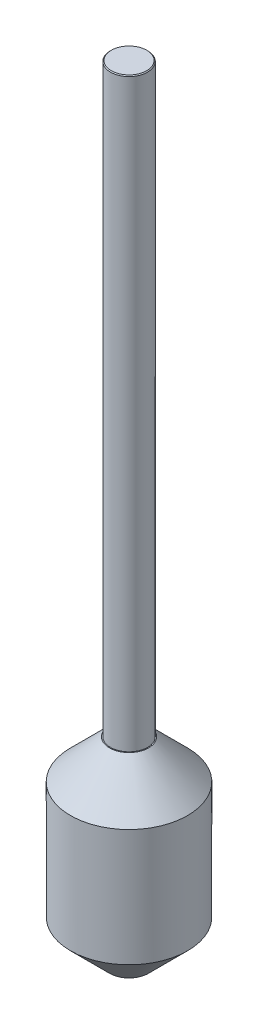
ISO-10303-21;
HEADER;
FILE_DESCRIPTION(('STEP AP214'),'2;1');
FILE_NAME('part.step','',(''),(''),'','','');
FILE_SCHEMA(('AUTOMOTIVE_DESIGN { 1 0 10303 214 1 1 1 1 }'));
ENDSEC;
DATA;
#1=APPLICATION_CONTEXT('core data for automotive mechanical design processes');
#2=APPLICATION_PROTOCOL_DEFINITION('international standard','automotive_design',2000,#1);
#3=PRODUCT_CONTEXT('',#1,'mechanical');
#4=PRODUCT('Part','Part','',(#3));
#5=PRODUCT_RELATED_PRODUCT_CATEGORY('part','',(#4));
#6=PRODUCT_DEFINITION_FORMATION('','',#4);
#7=PRODUCT_DEFINITION_CONTEXT('part definition',#1,'design');
#8=PRODUCT_DEFINITION('design','',#6,#7);
#9=PRODUCT_DEFINITION_SHAPE('','',#8);
#10=(LENGTH_UNIT() NAMED_UNIT(*) SI_UNIT(.MILLI.,.METRE.));
#11=(NAMED_UNIT(*) PLANE_ANGLE_UNIT() SI_UNIT($,.RADIAN.));
#12=(NAMED_UNIT(*) SI_UNIT($,.STERADIAN.) SOLID_ANGLE_UNIT());
#13=UNCERTAINTY_MEASURE_WITH_UNIT(LENGTH_MEASURE(1.E-05),#10,'distance_accuracy_value','');
#14=(GEOMETRIC_REPRESENTATION_CONTEXT(3) GLOBAL_UNCERTAINTY_ASSIGNED_CONTEXT((#13)) GLOBAL_UNIT_ASSIGNED_CONTEXT((#10,
#11,#12)) REPRESENTATION_CONTEXT('',''));
#15=CARTESIAN_POINT('',(0.,0.,0.));
#16=DIRECTION('',(0.,0.,1.));
#17=DIRECTION('',(1.,0.,0.));
#18=AXIS2_PLACEMENT_3D('',#15,#16,#17);
#19=CARTESIAN_POINT('',(5.,0.,0.));
#20=DIRECTION('',(0.,-1.,0.));
#21=DIRECTION('',(0.,0.,-1.));
#22=AXIS2_PLACEMENT_3D('',#19,#20,#21);
#23=CONICAL_SURFACE('',#22,5.,0.785398163397448);
#24=CARTESIAN_POINT('',(5.,-10.,0.));
#25=DIRECTION('',(0.,-1.,0.));
#26=DIRECTION('',(0.,0.,-1.));
#27=AXIS2_PLACEMENT_3D('',#24,#25,#26);
#28=CIRCLE('',#27,15.);
#29=CARTESIAN_POINT('',(5.,-10.,-15.));
#30=VERTEX_POINT('',#29);
#31=EDGE_CURVE('E10',#30,#30,#28,.T.);
#32=CARTESIAN_POINT('',(5.,0.,0.));
#33=DIRECTION('',(0.,-1.,0.));
#34=DIRECTION('',(0.,0.,-1.));
#35=AXIS2_PLACEMENT_3D('',#32,#33,#34);
#36=CIRCLE('',#35,5.);
#37=CARTESIAN_POINT('',(5.,0.,-5.));
#38=VERTEX_POINT('',#37);
#39=EDGE_CURVE('E63',#38,#38,#36,.T.);
#40=CARTESIAN_POINT('',(5.,-10.,-15.));
#41=CARTESIAN_POINT('',(5.,-9.89583333333333,-14.8958333333333));
#42=CARTESIAN_POINT('',(5.,-9.79166666666667,-14.7916666666667));
#43=CARTESIAN_POINT('',(5.,-9.58333333333333,-14.5833333333333));
#44=CARTESIAN_POINT('',(5.,-9.47916666666667,-14.4791666666667));
#45=CARTESIAN_POINT('',(5.,-9.27083333333333,-14.2708333333333));
#46=CARTESIAN_POINT('',(5.,-9.16666666666666,-14.1666666666667));
#47=CARTESIAN_POINT('',(5.,-8.95833333333333,-13.9583333333333));
#48=CARTESIAN_POINT('',(5.,-8.85416666666667,-13.8541666666667));
#49=CARTESIAN_POINT('',(5.,-8.64583333333333,-13.6458333333333));
#50=CARTESIAN_POINT('',(5.,-8.54166666666667,-13.5416666666667));
#51=CARTESIAN_POINT('',(5.,-8.33333333333333,-13.3333333333333));
#52=CARTESIAN_POINT('',(5.,-8.22916666666667,-13.2291666666667));
#53=CARTESIAN_POINT('',(5.,-8.02083333333333,-13.0208333333333));
#54=CARTESIAN_POINT('',(5.,-7.91666666666667,-12.9166666666667));
#55=CARTESIAN_POINT('',(5.,-7.70833333333333,-12.7083333333333));
#56=CARTESIAN_POINT('',(5.,-7.60416666666667,-12.6041666666667));
#57=CARTESIAN_POINT('',(5.,-7.39583333333333,-12.3958333333333));
#58=CARTESIAN_POINT('',(5.,-7.29166666666667,-12.2916666666667));
#59=CARTESIAN_POINT('',(5.,-7.08333333333333,-12.0833333333333));
#60=CARTESIAN_POINT('',(5.,-6.97916666666667,-11.9791666666667));
#61=CARTESIAN_POINT('',(5.,-6.77083333333333,-11.7708333333333));
#62=CARTESIAN_POINT('',(5.,-6.66666666666667,-11.6666666666667));
#63=CARTESIAN_POINT('',(5.,-6.45833333333333,-11.4583333333333));
#64=CARTESIAN_POINT('',(5.,-6.35416666666667,-11.3541666666667));
#65=CARTESIAN_POINT('',(5.,-6.14583333333333,-11.1458333333333));
#66=CARTESIAN_POINT('',(5.,-6.04166666666667,-11.0416666666667));
#67=CARTESIAN_POINT('',(5.,-5.83333333333333,-10.8333333333333));
#68=CARTESIAN_POINT('',(5.,-5.72916666666667,-10.7291666666667));
#69=CARTESIAN_POINT('',(5.,-5.52083333333333,-10.5208333333333));
#70=CARTESIAN_POINT('',(5.,-5.41666666666667,-10.4166666666667));
#71=CARTESIAN_POINT('',(5.,-5.20833333333333,-10.2083333333333));
#72=CARTESIAN_POINT('',(5.,-5.10416666666667,-10.1041666666667));
#73=CARTESIAN_POINT('',(5.,-4.89583333333333,-9.89583333333333));
#74=CARTESIAN_POINT('',(5.,-4.79166666666667,-9.79166666666667));
#75=CARTESIAN_POINT('',(5.,-4.58333333333333,-9.58333333333333));
#76=CARTESIAN_POINT('',(5.,-4.47916666666667,-9.47916666666667));
#77=CARTESIAN_POINT('',(5.,-4.27083333333333,-9.27083333333333));
#78=CARTESIAN_POINT('',(5.,-4.16666666666667,-9.16666666666666));
#79=CARTESIAN_POINT('',(5.,-3.95833333333333,-8.95833333333333));
#80=CARTESIAN_POINT('',(5.,-3.85416666666667,-8.85416666666666));
#81=CARTESIAN_POINT('',(5.,-3.64583333333333,-8.64583333333333));
#82=CARTESIAN_POINT('',(5.,-3.54166666666667,-8.54166666666667));
#83=CARTESIAN_POINT('',(5.,-3.33333333333333,-8.33333333333333));
#84=CARTESIAN_POINT('',(5.,-3.22916666666667,-8.22916666666667));
#85=CARTESIAN_POINT('',(5.,-3.02083333333333,-8.02083333333333));
#86=CARTESIAN_POINT('',(5.,-2.91666666666667,-7.91666666666667));
#87=CARTESIAN_POINT('',(5.,-2.70833333333333,-7.70833333333333));
#88=CARTESIAN_POINT('',(5.,-2.60416666666667,-7.60416666666667));
#89=CARTESIAN_POINT('',(5.,-2.39583333333333,-7.39583333333333));
#90=CARTESIAN_POINT('',(5.,-2.29166666666667,-7.29166666666667));
#91=CARTESIAN_POINT('',(5.,-2.08333333333333,-7.08333333333333));
#92=CARTESIAN_POINT('',(5.,-1.97916666666667,-6.97916666666667));
#93=CARTESIAN_POINT('',(5.,-1.77083333333333,-6.77083333333333));
#94=CARTESIAN_POINT('',(5.,-1.66666666666667,-6.66666666666667));
#95=CARTESIAN_POINT('',(5.,-1.45833333333333,-6.45833333333333));
#96=CARTESIAN_POINT('',(5.,-1.35416666666667,-6.35416666666667));
#97=CARTESIAN_POINT('',(5.,-1.14583333333333,-6.14583333333333));
#98=CARTESIAN_POINT('',(5.,-1.04166666666667,-6.04166666666667));
#99=CARTESIAN_POINT('',(5.,-0.833333333333333,-5.83333333333333));
#100=CARTESIAN_POINT('',(5.,-0.729166666666667,-5.72916666666667));
#101=CARTESIAN_POINT('',(5.,-0.520833333333334,-5.52083333333333));
#102=CARTESIAN_POINT('',(5.,-0.416666666666667,-5.41666666666667));
#103=CARTESIAN_POINT('',(5.,-0.208333333333334,-5.20833333333333));
#104=CARTESIAN_POINT('',(5.,-0.104166666666667,-5.10416666666667));
#105=CARTESIAN_POINT('',(5.,0.,-5.));
#106=B_SPLINE_CURVE_WITH_KNOTS('',3,(#40,#41,#42,#43,#44,#45,#46,#47,#48,#49,#50,#51,#52,#53,
#54,#55,#56,#57,#58,#59,#60,#61,#62,#63,#64,#65,#66,#67,#68,#69,#70,#71,#72,#73,#74,#75,#76,#77,
#78,#79,#80,#81,#82,#83,#84,#85,#86,#87,#88,#89,#90,#91,#92,#93,#94,#95,#96,#97,#98,#99,#100,
#101,#102,#103,#104,#105),.UNSPECIFIED.,.F.,.F.,(4,2,2,2,2,2,2,2,2,2,2,2,2,2,2,2,2,2,2,2,2,2,2,
2,2,2,2,2,2,2,2,2,4),(0.,0.441941738241593,0.883883476483185,1.32582521472478,1.76776695296637,
2.20970869120796,2.65165042944955,3.09359216769115,3.53553390593274,3.97747564417433,
4.41941738241592,4.86135912065751,5.30330085889911,5.7452425971407,6.18718433538229,
6.62912607362388,7.07106781186547,7.51300955010706,7.95495128834866,8.39689302659025,
8.83883476483184,9.28077650307343,9.72271824131502,10.1646599795566,10.6066017177982,
11.0485434560398,11.4904851942814,11.932426932523,12.3743686707646,12.8163104090062,
13.2582521472478,13.7001938854893,14.1421356237309),.UNSPECIFIED.);
#107=EDGE_CURVE('BSEAM40',#30,#38,#106,.T.);
#108=ORIENTED_EDGE('',*,*,#31,.F.);
#109=ORIENTED_EDGE('',*,*,#39,.T.);
#110=ORIENTED_EDGE('',*,*,#107,.T.);
#111=ORIENTED_EDGE('',*,*,#107,.F.);
#112=EDGE_LOOP('',(#108,#110,#109,#111));
#113=FACE_BOUND('',#112,.T.);
#114=ADVANCED_FACE('F40',(#113),#23,.T.);
#115=CARTESIAN_POINT('',(5.,0.,0.));
#116=DIRECTION('',(0.,-1.,0.));
#117=DIRECTION('',(0.,0.,-1.));
#118=AXIS2_PLACEMENT_3D('',#115,#116,#117);
#119=CYLINDRICAL_SURFACE('',#118,15.);
#120=CARTESIAN_POINT('',(5.,-40.,0.));
#121=DIRECTION('',(0.,-1.,0.));
#122=DIRECTION('',(0.,0.,-1.));
#123=AXIS2_PLACEMENT_3D('',#120,#121,#122);
#124=CIRCLE('',#123,15.);
#125=CARTESIAN_POINT('',(5.,-40.,15.));
#126=VERTEX_POINT('',#125);
#127=EDGE_CURVE('E47',#126,#126,#124,.T.);
#128=ORIENTED_EDGE('',*,*,#127,.F.);
#129=EDGE_LOOP('',(#128));
#130=FACE_BOUND('',#129,.T.);
#131=ORIENTED_EDGE('',*,*,#31,.T.);
#132=EDGE_LOOP('',(#131));
#133=FACE_BOUND('',#132,.T.);
#134=ADVANCED_FACE('F93',(#130,#133),#119,.T.);
#135=CARTESIAN_POINT('',(5.,-40.,0.));
#136=DIRECTION('',(0.,1.,0.));
#137=DIRECTION('',(0.,0.,1.));
#138=AXIS2_PLACEMENT_3D('',#135,#136,#137);
#139=CONICAL_SURFACE('',#138,15.,0.785398163397448);
#140=CARTESIAN_POINT('',(5.,-50.,0.));
#141=DIRECTION('',(0.,-1.,0.));
#142=DIRECTION('',(0.,0.,-1.));
#143=AXIS2_PLACEMENT_3D('',#140,#141,#142);
#144=CIRCLE('',#143,5.);
#145=CARTESIAN_POINT('',(5.,-50.,5.));
#146=VERTEX_POINT('',#145);
#147=EDGE_CURVE('E52',#146,#146,#144,.T.);
#148=CARTESIAN_POINT('',(5.,-50.,5.));
#149=CARTESIAN_POINT('',(5.,-49.8958333333333,5.10416666666667));
#150=CARTESIAN_POINT('',(5.,-49.7916666666667,5.20833333333334));
#151=CARTESIAN_POINT('',(5.,-49.5833333333333,5.41666666666667));
#152=CARTESIAN_POINT('',(5.,-49.4791666666667,5.52083333333334));
#153=CARTESIAN_POINT('',(5.,-49.2708333333333,5.72916666666667));
#154=CARTESIAN_POINT('',(5.,-49.1666666666667,5.83333333333334));
#155=CARTESIAN_POINT('',(5.,-48.9583333333333,6.04166666666667));
#156=CARTESIAN_POINT('',(5.,-48.8541666666667,6.14583333333334));
#157=CARTESIAN_POINT('',(5.,-48.6458333333333,6.35416666666667));
#158=CARTESIAN_POINT('',(5.,-48.5416666666667,6.45833333333334));
#159=CARTESIAN_POINT('',(5.,-48.3333333333333,6.66666666666667));
#160=CARTESIAN_POINT('',(5.,-48.2291666666667,6.77083333333334));
#161=CARTESIAN_POINT('',(5.,-48.0208333333333,6.97916666666667));
#162=CARTESIAN_POINT('',(5.,-47.9166666666667,7.08333333333334));
#163=CARTESIAN_POINT('',(5.,-47.7083333333333,7.29166666666667));
#164=CARTESIAN_POINT('',(5.,-47.6041666666667,7.39583333333334));
#165=CARTESIAN_POINT('',(5.,-47.3958333333333,7.60416666666667));
#166=CARTESIAN_POINT('',(5.,-47.2916666666667,7.70833333333334));
#167=CARTESIAN_POINT('',(5.,-47.0833333333333,7.91666666666667));
#168=CARTESIAN_POINT('',(5.,-46.9791666666667,8.02083333333334));
#169=CARTESIAN_POINT('',(5.,-46.7708333333333,8.22916666666667));
#170=CARTESIAN_POINT('',(5.,-46.6666666666667,8.33333333333334));
#171=CARTESIAN_POINT('',(5.,-46.4583333333333,8.54166666666667));
#172=CARTESIAN_POINT('',(5.,-46.3541666666667,8.64583333333334));
#173=CARTESIAN_POINT('',(5.,-46.1458333333333,8.85416666666667));
#174=CARTESIAN_POINT('',(5.,-46.0416666666667,8.95833333333334));
#175=CARTESIAN_POINT('',(5.,-45.8333333333333,9.16666666666667));
#176=CARTESIAN_POINT('',(5.,-45.7291666666667,9.27083333333334));
#177=CARTESIAN_POINT('',(5.,-45.5208333333333,9.47916666666667));
#178=CARTESIAN_POINT('',(5.,-45.4166666666667,9.58333333333334));
#179=CARTESIAN_POINT('',(5.,-45.2083333333333,9.79166666666667));
#180=CARTESIAN_POINT('',(5.,-45.1041666666667,9.89583333333334));
#181=CARTESIAN_POINT('',(5.,-44.8958333333333,10.1041666666667));
#182=CARTESIAN_POINT('',(5.,-44.7916666666667,10.2083333333333));
#183=CARTESIAN_POINT('',(5.,-44.5833333333333,10.4166666666667));
#184=CARTESIAN_POINT('',(5.,-44.4791666666667,10.5208333333333));
#185=CARTESIAN_POINT('',(5.,-44.2708333333333,10.7291666666667));
#186=CARTESIAN_POINT('',(5.,-44.1666666666667,10.8333333333333));
#187=CARTESIAN_POINT('',(5.,-43.9583333333333,11.0416666666667));
#188=CARTESIAN_POINT('',(5.,-43.8541666666667,11.1458333333333));
#189=CARTESIAN_POINT('',(5.,-43.6458333333333,11.3541666666667));
#190=CARTESIAN_POINT('',(5.,-43.5416666666667,11.4583333333333));
#191=CARTESIAN_POINT('',(5.,-43.3333333333333,11.6666666666667));
#192=CARTESIAN_POINT('',(5.,-43.2291666666667,11.7708333333333));
#193=CARTESIAN_POINT('',(5.,-43.0208333333333,11.9791666666667));
#194=CARTESIAN_POINT('',(5.,-42.9166666666667,12.0833333333333));
#195=CARTESIAN_POINT('',(5.,-42.7083333333333,12.2916666666667));
#196=CARTESIAN_POINT('',(5.,-42.6041666666667,12.3958333333333));
#197=CARTESIAN_POINT('',(5.,-42.3958333333333,12.6041666666667));
#198=CARTESIAN_POINT('',(5.,-42.2916666666667,12.7083333333333));
#199=CARTESIAN_POINT('',(5.,-42.0833333333333,12.9166666666667));
#200=CARTESIAN_POINT('',(5.,-41.9791666666667,13.0208333333333));
#201=CARTESIAN_POINT('',(5.,-41.7708333333333,13.2291666666667));
#202=CARTESIAN_POINT('',(5.,-41.6666666666667,13.3333333333333));
#203=CARTESIAN_POINT('',(5.,-41.4583333333333,13.5416666666667));
#204=CARTESIAN_POINT('',(5.,-41.3541666666667,13.6458333333333));
#205=CARTESIAN_POINT('',(5.,-41.1458333333333,13.8541666666667));
#206=CARTESIAN_POINT('',(5.,-41.0416666666667,13.9583333333333));
#207=CARTESIAN_POINT('',(5.,-40.8333333333333,14.1666666666667));
#208=CARTESIAN_POINT('',(5.,-40.7291666666667,14.2708333333333));
#209=CARTESIAN_POINT('',(5.,-40.5208333333333,14.4791666666667));
#210=CARTESIAN_POINT('',(5.,-40.4166666666667,14.5833333333333));
#211=CARTESIAN_POINT('',(5.,-40.2083333333333,14.7916666666667));
#212=CARTESIAN_POINT('',(5.,-40.1041666666667,14.8958333333333));
#213=CARTESIAN_POINT('',(5.,-40.,15.));
#214=B_SPLINE_CURVE_WITH_KNOTS('',3,(#148,#149,#150,#151,#152,#153,#154,#155,#156,#157,#158,
#159,#160,#161,#162,#163,#164,#165,#166,#167,#168,#169,#170,#171,#172,#173,#174,#175,#176,#177,
#178,#179,#180,#181,#182,#183,#184,#185,#186,#187,#188,#189,#190,#191,#192,#193,#194,#195,#196,
#197,#198,#199,#200,#201,#202,#203,#204,#205,#206,#207,#208,#209,#210,#211,#212,#213),
.UNSPECIFIED.,.F.,.F.,(4,2,2,2,2,2,2,2,2,2,2,2,2,2,2,2,2,2,2,2,2,2,2,2,2,2,2,2,2,2,2,2,4),(0.,
0.441941738241598,0.883883476483185,1.32582521472478,1.76776695296637,2.20970869120796,
2.65165042944955,3.09359216769115,3.53553390593274,3.97747564417433,4.41941738241592,
4.86135912065752,5.30330085889911,5.7452425971407,6.18718433538229,6.62912607362389,
7.07106781186548,7.51300955010707,7.95495128834866,8.39689302659025,8.83883476483185,
9.28077650307344,9.72271824131503,10.1646599795566,10.6066017177982,11.0485434560398,
11.4904851942814,11.932426932523,12.3743686707646,12.8163104090062,13.2582521472478,
13.7001938854894,14.142135623731),.UNSPECIFIED.);
#215=EDGE_CURVE('BSEAM98',#146,#126,#214,.T.);
#216=ORIENTED_EDGE('',*,*,#147,.F.);
#217=ORIENTED_EDGE('',*,*,#127,.T.);
#218=ORIENTED_EDGE('',*,*,#215,.T.);
#219=ORIENTED_EDGE('',*,*,#215,.F.);
#220=EDGE_LOOP('',(#216,#218,#217,#219));
#221=FACE_BOUND('',#220,.T.);
#222=ADVANCED_FACE('F98',(#221),#139,.T.);
#223=CARTESIAN_POINT('',(5.00000000000001,-50.,0.));
#224=DIRECTION('',(0.,1.,0.));
#225=DIRECTION('',(0.,0.,1.));
#226=AXIS2_PLACEMENT_3D('',#223,#224,#225);
#227=PLANE('',#226);
#228=ORIENTED_EDGE('',*,*,#147,.T.);
#229=EDGE_LOOP('',(#228));
#230=FACE_BOUND('',#229,.T.);
#231=ADVANCED_FACE('F109',(#230),#227,.F.);
#232=CARTESIAN_POINT('',(5.,150.,0.));
#233=DIRECTION('',(0.,-1.,0.));
#234=DIRECTION('',(0.,0.,-1.));
#235=AXIS2_PLACEMENT_3D('',#232,#233,#234);
#236=CYLINDRICAL_SURFACE('',#235,4.75649999999999);
#237=CARTESIAN_POINT('',(5.,0.,0.));
#238=DIRECTION('',(0.,-1.,0.));
#239=DIRECTION('',(0.,0.,-1.));
#240=AXIS2_PLACEMENT_3D('',#237,#238,#239);
#241=CIRCLE('',#240,4.7565);
#242=CARTESIAN_POINT('',(5.,0.,-4.7565));
#243=VERTEX_POINT('',#242);
#244=EDGE_CURVE('E57',#243,#243,#241,.T.);
#245=ORIENTED_EDGE('',*,*,#244,.F.);
#246=EDGE_LOOP('',(#245));
#247=FACE_BOUND('',#246,.T.);
#248=CARTESIAN_POINT('',(5.,149.7835,0.));
#249=DIRECTION('',(0.,-1.,0.));
#250=DIRECTION('',(0.,0.,-1.));
#251=AXIS2_PLACEMENT_3D('',#248,#249,#250);
#252=CIRCLE('',#251,4.75649999999998);
#253=CARTESIAN_POINT('',(5.,149.7835,-4.75649999999998));
#254=VERTEX_POINT('',#253);
#255=EDGE_CURVE('E71',#254,#254,#252,.T.);
#256=ORIENTED_EDGE('',*,*,#255,.T.);
#257=EDGE_LOOP('',(#256));
#258=FACE_BOUND('',#257,.T.);
#259=ADVANCED_FACE('F76',(#247,#258),#236,.T.);
#260=CARTESIAN_POINT('',(9.7565,0.,0.));
#261=DIRECTION('',(0.,-1.,0.));
#262=DIRECTION('',(0.,0.,-1.));
#263=AXIS2_PLACEMENT_3D('',#260,#261,#262);
#264=PLANE('',#263);
#265=ORIENTED_EDGE('',*,*,#39,.F.);
#266=EDGE_LOOP('',(#265));
#267=FACE_BOUND('',#266,.T.);
#268=ORIENTED_EDGE('',*,*,#244,.T.);
#269=EDGE_LOOP('',(#268));
#270=FACE_BOUND('',#269,.T.);
#271=ADVANCED_FACE('F82',(#267,#270),#264,.F.);
#272=CARTESIAN_POINT('',(5.,150.,0.));
#273=DIRECTION('',(0.,-1.,0.));
#274=DIRECTION('',(0.,0.,-1.));
#275=AXIS2_PLACEMENT_3D('',#272,#273,#274);
#276=CONICAL_SURFACE('',#275,4.54,0.785398163397452);
#277=ORIENTED_EDGE('',*,*,#255,.F.);
#278=EDGE_LOOP('',(#277));
#279=FACE_BOUND('',#278,.T.);
#280=CARTESIAN_POINT('',(5.,150.,0.));
#281=DIRECTION('',(0.,-1.,0.));
#282=DIRECTION('',(0.,0.,-1.));
#283=AXIS2_PLACEMENT_3D('',#280,#281,#282);
#284=CIRCLE('',#283,4.54);
#285=CARTESIAN_POINT('',(5.,150.,-4.54));
#286=VERTEX_POINT('',#285);
#287=EDGE_CURVE('E67',#286,#286,#284,.T.);
#288=ORIENTED_EDGE('',*,*,#287,.T.);
#289=EDGE_LOOP('',(#288));
#290=FACE_BOUND('',#289,.T.);
#291=ADVANCED_FACE('F78',(#279,#290),#276,.T.);
#292=CARTESIAN_POINT('',(0.,150.,0.));
#293=DIRECTION('',(0.,-1.,0.));
#294=DIRECTION('',(0.,0.,-1.));
#295=AXIS2_PLACEMENT_3D('',#292,#293,#294);
#296=PLANE('',#295);
#297=ORIENTED_EDGE('',*,*,#287,.F.);
#298=EDGE_LOOP('',(#297));
#299=FACE_BOUND('',#298,.T.);
#300=ADVANCED_FACE('F81',(#299),#296,.F.);
#301=CLOSED_SHELL('',(#114,#134,#222,#231,#259,#271,#291,#300));
#302=MANIFOLD_SOLID_BREP('B2',#301);
#303=ADVANCED_BREP_SHAPE_REPRESENTATION('',(#18,#302),#14);
#304=SHAPE_DEFINITION_REPRESENTATION(#9,#303);
ENDSEC;
END-ISO-10303-21;
